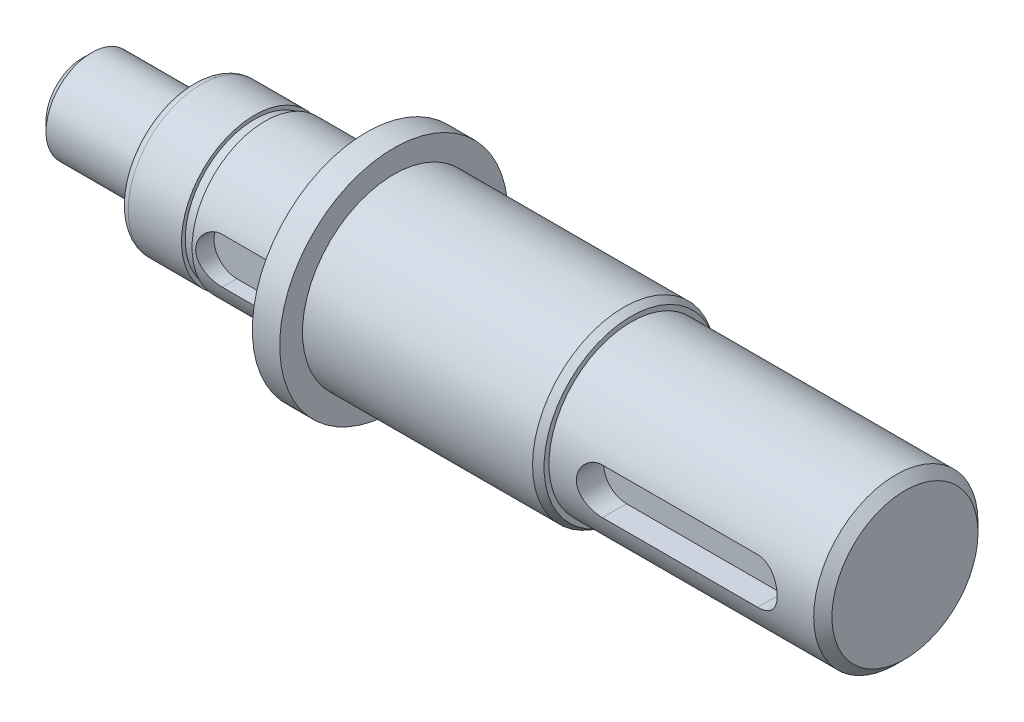
ISO-10303-21;
HEADER;
FILE_DESCRIPTION(('STEP AP214'),'2;1');
FILE_NAME('part.step','',(''),(''),'','','');
FILE_SCHEMA(('AUTOMOTIVE_DESIGN { 1 0 10303 214 1 1 1 1 }'));
ENDSEC;
DATA;
#1=APPLICATION_CONTEXT('core data for automotive mechanical design processes');
#2=APPLICATION_PROTOCOL_DEFINITION('international standard','automotive_design',2000,#1);
#3=PRODUCT_CONTEXT('',#1,'mechanical');
#4=PRODUCT('Part','Part','',(#3));
#5=PRODUCT_RELATED_PRODUCT_CATEGORY('part','',(#4));
#6=PRODUCT_DEFINITION_FORMATION('','',#4);
#7=PRODUCT_DEFINITION_CONTEXT('part definition',#1,'design');
#8=PRODUCT_DEFINITION('design','',#6,#7);
#9=PRODUCT_DEFINITION_SHAPE('','',#8);
#10=(LENGTH_UNIT() NAMED_UNIT(*) SI_UNIT(.MILLI.,.METRE.));
#11=(NAMED_UNIT(*) PLANE_ANGLE_UNIT() SI_UNIT($,.RADIAN.));
#12=(NAMED_UNIT(*) SI_UNIT($,.STERADIAN.) SOLID_ANGLE_UNIT());
#13=UNCERTAINTY_MEASURE_WITH_UNIT(LENGTH_MEASURE(1.E-05),#10,'distance_accuracy_value','');
#14=(GEOMETRIC_REPRESENTATION_CONTEXT(3) GLOBAL_UNCERTAINTY_ASSIGNED_CONTEXT((#13)) GLOBAL_UNIT_ASSIGNED_CONTEXT((#10,
#11,#12)) REPRESENTATION_CONTEXT('',''));
#15=CARTESIAN_POINT('',(0.,0.,0.));
#16=DIRECTION('',(0.,0.,1.));
#17=DIRECTION('',(1.,0.,0.));
#18=AXIS2_PLACEMENT_3D('',#15,#16,#17);
#19=CARTESIAN_POINT('',(-46.1,20.052,4.166614592372));
#20=DIRECTION('',(1.,0.,0.));
#21=DIRECTION('',(0.,-1.,0.));
#22=AXIS2_PLACEMENT_3D('',#19,#20,#21);
#23=PLANE('',#22);
#24=CARTESIAN_POINT('',(-46.1,15.892,0.));
#25=DIRECTION('',(1.,0.,0.));
#26=DIRECTION('',(0.,0.,-1.));
#27=AXIS2_PLACEMENT_3D('',#24,#25,#26);
#28=CIRCLE('',#27,3.99993093969182);
#29=CARTESIAN_POINT('',(-46.1,15.892,-3.99993093969182));
#30=VERTEX_POINT('',#29);
#31=EDGE_CURVE('E284',#30,#30,#28,.F.);
#32=ORIENTED_EDGE('',*,*,#31,.T.);
#33=EDGE_LOOP('',(#32));
#34=FACE_BOUND('',#33,.T.);
#35=ADVANCED_FACE('F17',(#34),#23,.F.);
#36=CARTESIAN_POINT('',(-46.1060096485574,15.892,0.));
#37=DIRECTION('',(1.,0.,0.));
#38=DIRECTION('',(0.,0.,-1.));
#39=AXIS2_PLACEMENT_3D('',#36,#37,#38);
#40=CONICAL_SURFACE('',#39,3.99392139489148,0.785389530779604);
#41=CARTESIAN_POINT('',(-45.0999136731147,15.892,0.));
#42=DIRECTION('',(1.,0.,0.));
#43=DIRECTION('',(0.,0.,-1.));
#44=AXIS2_PLACEMENT_3D('',#41,#42,#43);
#45=CIRCLE('',#44,5.);
#46=CARTESIAN_POINT('',(-45.0999136731147,15.892,-5.));
#47=VERTEX_POINT('',#46);
#48=EDGE_CURVE('E281',#47,#47,#45,.F.);
#49=ORIENTED_EDGE('',*,*,#48,.T.);
#50=EDGE_LOOP('',(#49));
#51=FACE_BOUND('',#50,.T.);
#52=ORIENTED_EDGE('',*,*,#31,.F.);
#53=EDGE_LOOP('',(#52));
#54=FACE_BOUND('',#53,.T.);
#55=ADVANCED_FACE('F610',(#51,#54),#40,.T.);
#56=CARTESIAN_POINT('',(-45.1660314850651,15.892,0.));
#57=DIRECTION('',(1.,0.,0.));
#58=DIRECTION('',(0.,0.,-1.));
#59=AXIS2_PLACEMENT_3D('',#56,#57,#58);
#60=CYLINDRICAL_SURFACE('',#59,5.);
#61=CARTESIAN_POINT('',(-34.1000000000029,15.892,0.));
#62=DIRECTION('',(1.,0.,0.));
#63=DIRECTION('',(0.,0.,-1.));
#64=AXIS2_PLACEMENT_3D('',#61,#62,#63);
#65=CIRCLE('',#64,5.);
#66=CARTESIAN_POINT('',(-34.1000000000029,15.892,-5.));
#67=VERTEX_POINT('',#66);
#68=EDGE_CURVE('E277',#67,#67,#65,.F.);
#69=ORIENTED_EDGE('',*,*,#68,.T.);
#70=EDGE_LOOP('',(#69));
#71=FACE_BOUND('',#70,.T.);
#72=ORIENTED_EDGE('',*,*,#48,.F.);
#73=EDGE_LOOP('',(#72));
#74=FACE_BOUND('',#73,.T.);
#75=ADVANCED_FACE('F312',(#71,#74),#60,.T.);
#76=CARTESIAN_POINT('',(-34.1,23.172,7.289055234136));
#77=DIRECTION('',(1.,0.,0.));
#78=DIRECTION('',(0.,-1.,0.));
#79=AXIS2_PLACEMENT_3D('',#76,#77,#78);
#80=PLANE('',#79);
#81=ORIENTED_EDGE('',*,*,#68,.F.);
#82=EDGE_LOOP('',(#81));
#83=FACE_BOUND('',#82,.T.);
#84=CARTESIAN_POINT('',(-34.1,15.892,0.));
#85=DIRECTION('',(1.,0.,0.));
#86=DIRECTION('',(0.,-1.,-3.17218194916288E-13));
#87=AXIS2_PLACEMENT_3D('',#84,#85,#86);
#88=CIRCLE('',#87,6.99999999999759);
#89=CARTESIAN_POINT('',(-34.1,22.891999999999,9.57036668880821E-10));
#90=VERTEX_POINT('',#89);
#91=CARTESIAN_POINT('',(-34.1,8.89200000000105,-3.19891899427937E-10));
#92=VERTEX_POINT('',#91);
#93=EDGE_CURVE('E100',#90,#92,#88,.F.);
#94=ORIENTED_EDGE('',*,*,#93,.T.);
#95=CARTESIAN_POINT('',(-34.1,15.892,0.));
#96=DIRECTION('',(1.,0.,0.));
#97=DIRECTION('',(0.,1.,2.27869295233494E-10));
#98=AXIS2_PLACEMENT_3D('',#95,#96,#97);
#99=CIRCLE('',#98,6.99999999999958);
#100=EDGE_CURVE('E280',#92,#90,#99,.F.);
#101=ORIENTED_EDGE('',*,*,#100,.T.);
#102=EDGE_LOOP('',(#94,#101));
#103=FACE_BOUND('',#102,.T.);
#104=ADVANCED_FACE('F311',(#83,#103),#80,.F.);
#105=CARTESIAN_POINT('',(-33.1,15.892,0.));
#106=DIRECTION('',(1.,0.,0.));
#107=DIRECTION('',(0.,0.999626843304634,0.0273161883287667));
#108=AXIS2_PLACEMENT_3D('',#105,#106,#107);
#109=TOROIDAL_SURFACE('',#108,6.99999999999756,1.);
#110=CARTESIAN_POINT('',(-33.1,15.892,0.));
#111=DIRECTION('',(1.,0.,0.));
#112=DIRECTION('',(0.,-1.,0.));
#113=AXIS2_PLACEMENT_3D('',#110,#111,#112);
#114=CIRCLE('',#113,8.);
#115=CARTESIAN_POINT('',(-33.1,7.892,0.));
#116=VERTEX_POINT('',#115);
#117=EDGE_CURVE('E276',#116,#116,#114,.F.);
#118=ORIENTED_EDGE('',*,*,#117,.T.);
#119=EDGE_LOOP('',(#118));
#120=FACE_BOUND('',#119,.T.);
#121=ORIENTED_EDGE('',*,*,#100,.F.);
#122=ORIENTED_EDGE('',*,*,#93,.F.);
#123=EDGE_LOOP('',(#121,#122));
#124=FACE_BOUND('',#123,.T.);
#125=ADVANCED_FACE('F295',(#120,#124),#109,.T.);
#126=CARTESIAN_POINT('',(-33.1,15.892,0.));
#127=DIRECTION('',(1.,0.,0.));
#128=DIRECTION('',(0.,0.,-1.));
#129=AXIS2_PLACEMENT_3D('',#126,#127,#128);
#130=CYLINDRICAL_SURFACE('',#129,8.);
#131=CARTESIAN_POINT('',(-27.25,15.892,0.));
#132=DIRECTION('',(1.,0.,0.));
#133=DIRECTION('',(0.,0.,-1.));
#134=AXIS2_PLACEMENT_3D('',#131,#132,#133);
#135=CIRCLE('',#134,8.);
#136=CARTESIAN_POINT('',(-27.25,15.892,-8.));
#137=VERTEX_POINT('',#136);
#138=EDGE_CURVE('E273',#137,#137,#135,.T.);
#139=ORIENTED_EDGE('',*,*,#138,.F.);
#140=EDGE_LOOP('',(#139));
#141=FACE_BOUND('',#140,.T.);
#142=ORIENTED_EDGE('',*,*,#117,.F.);
#143=EDGE_LOOP('',(#142));
#144=FACE_BOUND('',#143,.T.);
#145=ADVANCED_FACE('F310',(#141,#144),#130,.T.);
#146=CARTESIAN_POINT('',(-27.25,24.212,8.32));
#147=DIRECTION('',(1.,0.,0.));
#148=DIRECTION('',(0.,-1.,0.));
#149=AXIS2_PLACEMENT_3D('',#146,#147,#148);
#150=PLANE('',#149);
#151=CARTESIAN_POINT('',(-27.2499999999977,15.892,0.));
#152=DIRECTION('',(1.,0.,0.));
#153=DIRECTION('',(0.,0.,-1.));
#154=AXIS2_PLACEMENT_3D('',#151,#152,#153);
#155=CIRCLE('',#154,7.6);
#156=CARTESIAN_POINT('',(-27.2499999999977,15.892,-7.6));
#157=VERTEX_POINT('',#156);
#158=EDGE_CURVE('E270',#157,#157,#155,.F.);
#159=ORIENTED_EDGE('',*,*,#158,.T.);
#160=EDGE_LOOP('',(#159));
#161=FACE_BOUND('',#160,.T.);
#162=ORIENTED_EDGE('',*,*,#138,.T.);
#163=EDGE_LOOP('',(#162));
#164=FACE_BOUND('',#163,.T.);
#165=ADVANCED_FACE('F335',(#161,#164),#150,.T.);
#166=CARTESIAN_POINT('',(-27.2499999999977,15.892,0.));
#167=DIRECTION('',(1.,0.,0.));
#168=DIRECTION('',(0.,0.,-1.));
#169=AXIS2_PLACEMENT_3D('',#166,#167,#168);
#170=CYLINDRICAL_SURFACE('',#169,7.6);
#171=CARTESIAN_POINT('',(-26.1000000000023,15.892,0.));
#172=DIRECTION('',(1.,0.,0.));
#173=DIRECTION('',(0.,0.,-1.));
#174=AXIS2_PLACEMENT_3D('',#171,#172,#173);
#175=CIRCLE('',#174,7.6);
#176=CARTESIAN_POINT('',(-26.1000000000023,15.892,-7.6));
#177=VERTEX_POINT('',#176);
#178=EDGE_CURVE('E263',#177,#177,#175,.F.);
#179=ORIENTED_EDGE('',*,*,#178,.T.);
#180=EDGE_LOOP('',(#179));
#181=FACE_BOUND('',#180,.T.);
#182=ORIENTED_EDGE('',*,*,#158,.F.);
#183=EDGE_LOOP('',(#182));
#184=FACE_BOUND('',#183,.T.);
#185=ADVANCED_FACE('F339',(#181,#184),#170,.T.);
#186=CARTESIAN_POINT('',(-27.00141579005,13.27192889347,6.));
#187=DIRECTION('',(0.,0.,1.));
#188=DIRECTION('',(1.,0.,0.));
#189=AXIS2_PLACEMENT_3D('',#186,#187,#188);
#190=PLANE('',#189);
#191=CARTESIAN_POINT('',(-17.9,15.892,5.99999999999976));
#192=DIRECTION('',(0.,0.,1.));
#193=DIRECTION('',(0.,-1.,0.));
#194=AXIS2_PLACEMENT_3D('',#191,#192,#193);
#195=CIRCLE('',#194,2.5);
#196=CARTESIAN_POINT('',(-17.8999999999994,18.392,5.99999999999979));
#197=VERTEX_POINT('',#196);
#198=CARTESIAN_POINT('',(-17.8999999999996,13.392,5.99999999999979));
#199=VERTEX_POINT('',#198);
#200=EDGE_CURVE('E259',#197,#199,#195,.F.);
#201=ORIENTED_EDGE('',*,*,#200,.F.);
#202=DIRECTION('',(-1.,0.,0.));
#203=VECTOR('',#202,1.);
#204=CARTESIAN_POINT('',(-20.55,18.392,5.99999999999981));
#205=LINE('',#204,#203);
#206=CARTESIAN_POINT('',(-23.1999999999986,18.392,5.9999999999998));
#207=VERTEX_POINT('',#206);
#208=EDGE_CURVE('E266',#197,#207,#205,.T.);
#209=ORIENTED_EDGE('',*,*,#208,.T.);
#210=CARTESIAN_POINT('',(-23.2,15.892,5.99999999999979));
#211=DIRECTION('',(0.,0.,1.));
#212=DIRECTION('',(1.,0.,0.));
#213=AXIS2_PLACEMENT_3D('',#210,#211,#212);
#214=CIRCLE('',#213,2.5);
#215=CARTESIAN_POINT('',(-23.1999999999987,13.392,5.9999999999998));
#216=VERTEX_POINT('',#215);
#217=EDGE_CURVE('E93',#216,#207,#214,.F.);
#218=ORIENTED_EDGE('',*,*,#217,.F.);
#219=DIRECTION('',(1.,0.,0.));
#220=VECTOR('',#219,1.);
#221=CARTESIAN_POINT('',(-20.55,13.392,5.99999999999981));
#222=LINE('',#221,#220);
#223=EDGE_CURVE('E267',#216,#199,#222,.T.);
#224=ORIENTED_EDGE('',*,*,#223,.T.);
#225=EDGE_LOOP('',(#201,#209,#218,#224));
#226=FACE_BOUND('',#225,.T.);
#227=ADVANCED_FACE('F341',(#226),#190,.T.);
#228=CARTESIAN_POINT('',(-23.2,15.892,5.99999999999979));
#229=DIRECTION('',(0.,0.,1.));
#230=DIRECTION('',(1.,0.,0.));
#231=AXIS2_PLACEMENT_3D('',#228,#229,#230);
#232=CYLINDRICAL_SURFACE('',#231,2.5);
#233=ORIENTED_EDGE('',*,*,#217,.T.);
#234=DIRECTION('',(0.,0.,1.));
#235=VECTOR('',#234,1.);
#236=CARTESIAN_POINT('',(-23.1999999999971,18.392,6.7996710383925));
#237=LINE('',#236,#235);
#238=CARTESIAN_POINT('',(-23.1999999999986,18.3920000000008,7.59934207678505));
#239=VERTEX_POINT('',#238);
#240=EDGE_CURVE('E641',#207,#239,#237,.T.);
#241=ORIENTED_EDGE('',*,*,#240,.T.);
#242=CARTESIAN_POINT('',(-23.1999999999991,18.392,7.59934207678533));
#243=CARTESIAN_POINT('',(-23.268466040457,18.3920087198661,7.59933203220922));
#244=CARTESIAN_POINT('',(-23.3369263800278,18.3891876157067,7.60026710840751));
#245=CARTESIAN_POINT('',(-23.4733214902587,18.3779536316015,7.60395280971294));
#246=CARTESIAN_POINT('',(-23.541256383595,18.369542099326,7.60670299725463));
#247=CARTESIAN_POINT('',(-23.675938990515,18.3472250498683,7.61393458112739));
#248=CARTESIAN_POINT('',(-23.7426894002958,18.3333343337494,7.6184113127803));
#249=CARTESIAN_POINT('',(-23.8747019778926,18.3001974202135,7.62895048428862));
#250=CARTESIAN_POINT('',(-23.9399641014081,18.2809510636041,7.63501297127909));
#251=CARTESIAN_POINT('',(-24.132787776406,18.2154218181209,7.65531370854744));
#252=CARTESIAN_POINT('',(-24.2575680580731,18.1613183478365,7.67167572075663));
#253=CARTESIAN_POINT('',(-24.4962875697815,18.0339585337533,7.70820192005291));
#254=CARTESIAN_POINT('',(-24.6102211254839,17.96069223943,7.72836808096848));
#255=CARTESIAN_POINT('',(-24.8279499761722,17.794394884502,7.77100200100192));
#256=CARTESIAN_POINT('',(-24.9313222643879,17.700822206298,7.79352168290418));
#257=CARTESIAN_POINT('',(-25.121190817295,17.4977272795654,7.83788426191883));
#258=CARTESIAN_POINT('',(-25.2076841783887,17.3882022924899,7.85972704204449));
#259=CARTESIAN_POINT('',(-25.3632232640836,17.1532495377186,7.90087147079035));
#260=CARTESIAN_POINT('',(-25.4318300473664,17.0275180788054,7.92010445950419));
#261=CARTESIAN_POINT('',(-25.5467540849779,16.7656029603361,7.95325160259874));
#262=CARTESIAN_POINT('',(-25.5930774702847,16.6294221877389,7.96716721976599));
#263=CARTESIAN_POINT('',(-25.6607018859891,16.354930099013,7.98774341182987));
#264=CARTESIAN_POINT('',(-25.6827310447468,16.2168142475096,7.99461464054533));
#265=CARTESIAN_POINT('',(-25.7034487255046,15.9386844774618,8.00107192504111));
#266=CARTESIAN_POINT('',(-25.7021420799053,15.7986709578888,8.00065948912981));
#267=CARTESIAN_POINT('',(-25.6767033454027,15.5258502685509,7.99274230032519));
#268=CARTESIAN_POINT('',(-25.6533609718519,15.3929612040198,7.98548293529428));
#269=CARTESIAN_POINT('',(-25.5858095044392,15.1330924132136,7.96498949974393));
#270=CARTESIAN_POINT('',(-25.5415992887317,15.0061130050421,7.95175510801149));
#271=CARTESIAN_POINT('',(-25.4330593669408,14.7598431445353,7.92046911120723));
#272=CARTESIAN_POINT('',(-25.3684898247105,14.6406659405492,7.90236047968));
#273=CARTESIAN_POINT('',(-25.2212568035245,14.4145938380772,7.86323423851875));
#274=CARTESIAN_POINT('',(-25.1385889392499,14.3077019259718,7.84221592430786));
#275=CARTESIAN_POINT('',(-24.9534618636045,14.104534133926,7.79847545376818));
#276=CARTESIAN_POINT('',(-24.8503225922691,14.0088845641417,7.77571879037668));
#277=CARTESIAN_POINT('',(-24.6292296898957,13.8360346115086,7.7318162261217));
#278=CARTESIAN_POINT('',(-24.5112716111507,13.7588397879334,7.71067081193149));
#279=CARTESIAN_POINT('',(-24.2620970568147,13.6243507400244,7.67220528704834));
#280=CARTESIAN_POINT('',(-24.130741698535,13.5672997270673,7.65493278862487));
#281=CARTESIAN_POINT('',(-23.8596881269535,13.4763908777028,7.62673815128791));
#282=CARTESIAN_POINT('',(-23.7200031693129,13.4424972061721,7.61580620458638));
#283=CARTESIAN_POINT('',(-23.5158248989925,13.4112165686691,7.60564225124822));
#284=CARTESIAN_POINT('',(-23.4528550630587,13.4040119274096,7.60328541577439));
#285=CARTESIAN_POINT('',(-23.3266010066542,13.3944075529522,7.60013482131107));
#286=CARTESIAN_POINT('',(-23.2633173572024,13.3920010344104,7.59933885501905));
#287=CARTESIAN_POINT('',(-23.1999999999996,13.392,7.59934207678533));
#288=B_SPLINE_CURVE_WITH_KNOTS('',3,(#242,#243,#244,#245,#246,#247,#248,#249,#250,#251,#252,
#253,#254,#255,#256,#257,#258,#259,#260,#261,#262,#263,#264,#265,#266,#267,#268,#269,#270,#271,
#272,#273,#274,#275,#276,#277,#278,#279,#280,#281,#282,#283,#284,#285,#286,#287),.UNSPECIFIED.,
.F.,.F.,(4,2,2,2,2,2,2,2,2,2,2,2,2,2,2,2,2,2,2,2,2,2,4),(0.,0.205323959879018,0.410598440771324,
0.615322164613738,0.820051974362681,1.22896577749252,1.63809233699269,2.05988351400973,
2.48174718582279,2.91315381297349,3.34444167638904,3.76241894392413,4.18030965733322,
4.58377069824367,4.98725343150322,5.39567896994651,5.80420358180202,6.22971654236821,
6.6553575226075,7.0859747210148,7.51592403685468,7.70602799872379,7.89586293072618),.UNSPECIFIED.);
#289=CARTESIAN_POINT('',(-23.1999999999985,13.392,7.59934207678531));
#290=VERTEX_POINT('',#289);
#291=EDGE_CURVE('E253',#239,#290,#288,.T.);
#292=ORIENTED_EDGE('',*,*,#291,.T.);
#293=DIRECTION('',(0.,0.,-1.));
#294=VECTOR('',#293,1.);
#295=CARTESIAN_POINT('',(-23.1999999999973,13.392,6.7996710383925));
#296=LINE('',#295,#294);
#297=EDGE_CURVE('E269',#290,#216,#296,.T.);
#298=ORIENTED_EDGE('',*,*,#297,.T.);
#299=EDGE_LOOP('',(#233,#241,#292,#298));
#300=FACE_BOUND('',#299,.T.);
#301=ADVANCED_FACE('F239',(#300),#232,.F.);
#302=CARTESIAN_POINT('',(-23.32007110653,13.392,5.879928893467));
#303=DIRECTION('',(0.,-1.,0.));
#304=DIRECTION('',(1.,0.,0.));
#305=AXIS2_PLACEMENT_3D('',#302,#303,#304);
#306=PLANE('',#305);
#307=ORIENTED_EDGE('',*,*,#223,.F.);
#308=ORIENTED_EDGE('',*,*,#297,.F.);
#309=DIRECTION('',(1.,0.,0.));
#310=VECTOR('',#309,1.);
#311=CARTESIAN_POINT('',(-24.8,13.392,7.59934207678529));
#312=LINE('',#311,#310);
#313=CARTESIAN_POINT('',(-17.8999999999996,13.392,7.59934207678531));
#314=VERTEX_POINT('',#313);
#315=EDGE_CURVE('E252',#290,#314,#312,.T.);
#316=ORIENTED_EDGE('',*,*,#315,.T.);
#317=DIRECTION('',(0.,0.,1.));
#318=VECTOR('',#317,1.);
#319=CARTESIAN_POINT('',(-17.8999999999992,13.392,7.240537065298));
#320=LINE('',#319,#318);
#321=EDGE_CURVE('E258',#199,#314,#320,.T.);
#322=ORIENTED_EDGE('',*,*,#321,.F.);
#323=EDGE_LOOP('',(#307,#308,#316,#322));
#324=FACE_BOUND('',#323,.T.);
#325=ADVANCED_FACE('F344',(#324),#306,.F.);
#326=CARTESIAN_POINT('',(-26.1,24.212,8.32));
#327=DIRECTION('',(1.,0.,0.));
#328=DIRECTION('',(0.,-1.,0.));
#329=AXIS2_PLACEMENT_3D('',#326,#327,#328);
#330=PLANE('',#329);
#331=ORIENTED_EDGE('',*,*,#178,.F.);
#332=EDGE_LOOP('',(#331));
#333=FACE_BOUND('',#332,.T.);
#334=CARTESIAN_POINT('',(-26.1000000000004,15.892,0.));
#335=DIRECTION('',(1.,0.,0.));
#336=DIRECTION('',(0.,0.,-1.));
#337=AXIS2_PLACEMENT_3D('',#334,#335,#336);
#338=CIRCLE('',#337,8.);
#339=CARTESIAN_POINT('',(-26.1000000000004,15.892,-8.));
#340=VERTEX_POINT('',#339);
#341=EDGE_CURVE('E251',#340,#340,#338,.F.);
#342=ORIENTED_EDGE('',*,*,#341,.T.);
#343=EDGE_LOOP('',(#342));
#344=FACE_BOUND('',#343,.T.);
#345=ADVANCED_FACE('F346',(#333,#344),#330,.F.);
#346=CARTESIAN_POINT('',(-17.77992889347,18.392,5.879928893467));
#347=DIRECTION('',(0.,1.,0.));
#348=DIRECTION('',(-1.,0.,0.));
#349=AXIS2_PLACEMENT_3D('',#346,#347,#348);
#350=PLANE('',#349);
#351=ORIENTED_EDGE('',*,*,#208,.F.);
#352=DIRECTION('',(0.,0.,-1.));
#353=VECTOR('',#352,1.);
#354=CARTESIAN_POINT('',(-17.8999999999988,18.392,7.240537065298));
#355=LINE('',#354,#353);
#356=CARTESIAN_POINT('',(-17.8999999999994,18.3920000000005,7.59934207678505));
#357=VERTEX_POINT('',#356);
#358=EDGE_CURVE('E262',#357,#197,#355,.T.);
#359=ORIENTED_EDGE('',*,*,#358,.F.);
#360=DIRECTION('',(-1.,0.,0.));
#361=VECTOR('',#360,1.);
#362=CARTESIAN_POINT('',(-24.8,18.3920000000017,7.59934207678477));
#363=LINE('',#362,#361);
#364=EDGE_CURVE('E219',#357,#239,#363,.T.);
#365=ORIENTED_EDGE('',*,*,#364,.T.);
#366=ORIENTED_EDGE('',*,*,#240,.F.);
#367=EDGE_LOOP('',(#351,#359,#365,#366));
#368=FACE_BOUND('',#367,.T.);
#369=ADVANCED_FACE('F146',(#368),#350,.F.);
#370=CARTESIAN_POINT('',(-17.9,15.892,5.99999999999976));
#371=DIRECTION('',(0.,0.,1.));
#372=DIRECTION('',(0.,-1.,0.));
#373=AXIS2_PLACEMENT_3D('',#370,#371,#372);
#374=CYLINDRICAL_SURFACE('',#373,2.5);
#375=CARTESIAN_POINT('',(-17.9,13.392,7.59934207678533));
#376=CARTESIAN_POINT('',(-17.8307676309302,13.3919906346233,7.59933144652561));
#377=CARTESIAN_POINT('',(-17.7615403165906,13.3948756110885,7.60028787623918));
#378=CARTESIAN_POINT('',(-17.6236209875084,13.4063632206783,7.60405660679211));
#379=CARTESIAN_POINT('',(-17.5549289045328,13.414965112514,7.60686866701922));
#380=CARTESIAN_POINT('',(-17.420282699433,13.4375313680281,7.61417839126841));
#381=CARTESIAN_POINT('',(-17.3543029742056,13.451357023005,7.6186323875736));
#382=CARTESIAN_POINT('',(-17.2238131843165,13.4842411911719,7.62908875779236));
#383=CARTESIAN_POINT('',(-17.1593029136853,13.5032989660408,7.63509091323304));
#384=CARTESIAN_POINT('',(-16.9912061568558,13.5604225465108,7.65278632583324));
#385=CARTESIAN_POINT('',(-16.8891690129333,13.6028306413595,7.66565720793278));
#386=CARTESIAN_POINT('',(-16.7402446128303,13.6765686484905,7.68716672499754));
#387=CARTESIAN_POINT('',(-16.6907939064981,13.7031712990599,7.6947961786488));
#388=CARTESIAN_POINT('',(-16.5938753541194,13.7595891478415,7.71062133362359));
#389=CARTESIAN_POINT('',(-16.5464068884295,13.7894033315457,7.71881685583697));
#390=CARTESIAN_POINT('',(-16.5000000000017,13.8207684822781,7.7272245987803));
#391=B_SPLINE_CURVE_WITH_KNOTS('',3,(#375,#376,#377,#378,#379,#380,#381,#382,#383,#384,#385,
#386,#387,#388,#389,#390),.UNSPECIFIED.,.F.,.F.,(4,2,2,2,2,2,2,4),(0.,0.207622136681109,
0.415217357110299,0.617648837901875,0.82005176761171,1.15261657682252,1.32251533214893,
1.49236057379962),.UNSPECIFIED.);
#392=CARTESIAN_POINT('',(-16.5000000000008,13.8207684822787,7.72722459877862));
#393=VERTEX_POINT('',#392);
#394=EDGE_CURVE('E245',#314,#393,#391,.T.);
#395=ORIENTED_EDGE('',*,*,#394,.T.);
#396=CARTESIAN_POINT('',(-16.4999999999987,17.9632315177199,7.72722459877718));
#397=CARTESIAN_POINT('',(-16.4471427126387,17.927508338568,7.73683009394156));
#398=CARTESIAN_POINT('',(-16.39613754107,17.8900816328268,7.74945716500654));
#399=CARTESIAN_POINT('',(-16.2980844717545,17.8123546853294,7.77942145014326));
#400=CARTESIAN_POINT('',(-16.2510247354012,17.7720637634431,7.79674386089434));
#401=CARTESIAN_POINT('',(-16.1610080491993,17.6891196952703,7.83474751936062));
#402=CARTESIAN_POINT('',(-16.118031957615,17.6464792186134,7.85541172995629));
#403=CARTESIAN_POINT('',(-16.0358066346301,17.5588519538789,7.89917695815186));
#404=CARTESIAN_POINT('',(-15.996560929259,17.513863006989,7.92228023852264));
#405=CARTESIAN_POINT('',(-15.911237298747,17.408774357714,7.97674573975147));
#406=CARTESIAN_POINT('',(-15.8663345671442,17.3479783452396,8.00860565369107));
#407=CARTESIAN_POINT('',(-15.7823870511854,17.222935323822,8.0732598184387));
#408=CARTESIAN_POINT('',(-15.7433435802625,17.1586875454887,8.10605427678302));
#409=CARTESIAN_POINT('',(-15.6709991652825,17.0265643067415,8.17107706387074));
#410=CARTESIAN_POINT('',(-15.6377089477016,16.9586823727563,8.2033042366342));
#411=CARTESIAN_POINT('',(-15.5771045147689,16.8193247518581,8.26538007025524));
#412=CARTESIAN_POINT('',(-15.5497860491919,16.7478516656966,8.29523041307113));
#413=CARTESIAN_POINT('',(-15.49733464839,16.5886634970294,8.3552084265505));
#414=CARTESIAN_POINT('',(-15.4733468947828,16.5002418068047,8.38453420328385));
#415=CARTESIAN_POINT('',(-15.4445704885365,16.3642353004137,8.42094474397633));
#416=CARTESIAN_POINT('',(-15.4361858577654,16.3184031074565,8.43180876694419));
#417=CARTESIAN_POINT('',(-15.4219356239277,16.2257526088139,8.45052527207993));
#418=CARTESIAN_POINT('',(-15.4160686314022,16.178934862052,8.45837941511325));
#419=CARTESIAN_POINT('',(-15.4069204709648,16.083983582356,8.47071992959463));
#420=CARTESIAN_POINT('',(-15.4036733949887,16.035840876608,8.47516186483016));
#421=CARTESIAN_POINT('',(-15.3999794131921,15.9392474247854,8.48022057581262));
#422=CARTESIAN_POINT('',(-15.3995322650363,15.890796705733,8.48083768260056));
#423=CARTESIAN_POINT('',(-15.401451421842,15.7940271765907,8.47820399474554));
#424=CARTESIAN_POINT('',(-15.4038195436657,15.7457084718771,8.47495070230127));
#425=CARTESIAN_POINT('',(-15.4113057046628,15.6496738359529,8.4647900975488));
#426=CARTESIAN_POINT('',(-15.4164242159587,15.6019580096702,8.4578821578995));
#427=CARTESIAN_POINT('',(-15.430220870351,15.5006295915979,8.43959046264796));
#428=CARTESIAN_POINT('',(-15.439307331954,15.4471643858342,8.42770320504371));
#429=CARTESIAN_POINT('',(-15.460709817151,15.3417637238871,8.40045715541123));
#430=CARTESIAN_POINT('',(-15.4730284561016,15.2898295445809,8.38509555346947));
#431=CARTESIAN_POINT('',(-15.5007443461197,15.187445124131,8.35164063289247));
#432=CARTESIAN_POINT('',(-15.5161544759742,15.1370021389172,8.3335359668943));
#433=CARTESIAN_POINT('',(-15.5498506646406,15.0378699383645,8.29539467249833));
#434=CARTESIAN_POINT('',(-15.5681359379182,14.9891802484505,8.27535857237551));
#435=CARTESIAN_POINT('',(-15.616787309896,14.8708477231922,8.22421567236482));
#436=CARTESIAN_POINT('',(-15.6487754541508,14.8021933060676,8.19235695989968));
#437=CARTESIAN_POINT('',(-15.7186038991308,14.6683948832343,8.12763861334563));
#438=CARTESIAN_POINT('',(-15.7564473940816,14.6032528199067,8.09477844084207));
#439=CARTESIAN_POINT('',(-15.8378094434959,14.476727097249,8.02980600135416));
#440=CARTESIAN_POINT('',(-15.8812999023814,14.4153269070777,7.99769090271235));
#441=CARTESIAN_POINT('',(-15.9742003265235,14.2960648272229,7.93564357325767));
#442=CARTESIAN_POINT('',(-16.0236067949193,14.2382008775771,7.90571006960731));
#443=CARTESIAN_POINT('',(-16.1379281597735,14.1162577452054,7.84477577982577));
#444=CARTESIAN_POINT('',(-16.2040397717132,14.0528943045051,7.81452588699238));
#445=CARTESIAN_POINT('',(-16.3098655331644,13.9623253459424,7.77587668167656));
#446=CARTESIAN_POINT('',(-16.346372295547,13.9327984720178,7.76408895003779));
#447=CARTESIAN_POINT('',(-16.4215716943065,13.8754454529992,7.74336330145432));
#448=CARTESIAN_POINT('',(-16.4602681267636,13.8476224471132,7.73443052392133));
#449=CARTESIAN_POINT('',(-16.5000000000012,13.8207684822784,7.72722459877672));
#450=B_SPLINE_CURVE_WITH_KNOTS('',3,(#396,#397,#398,#399,#400,#401,#402,#403,#404,#405,#406,
#407,#408,#409,#410,#411,#412,#413,#414,#415,#416,#417,#418,#419,#420,#421,#422,#423,#424,#425,
#426,#427,#428,#429,#430,#431,#432,#433,#434,#435,#436,#437,#438,#439,#440,#441,#442,#443,#444,
#445,#446,#447,#448,#449),.UNSPECIFIED.,.F.,.F.,(4,2,2,2,2,2,2,2,2,2,2,2,2,2,2,2,2,2,2,2,2,2,2,
2,2,2,4),(0.,0.193250382530402,0.385898438960346,0.577593627803931,0.769468245211612,
1.01521129125635,1.26100934192758,1.50726083192933,1.75333648463101,2.04090367885842,
2.18429162223625,2.32760032917257,2.47274507057201,2.61787724943848,2.76310314165579,
2.90835397082064,3.07465137742126,3.24108376285949,3.40822444803153,3.57531954683954,
3.82149027685007,4.06779577511818,4.31291968500812,4.55789941463913,4.84629233884293,
4.99137772778695,5.13672284337354),.UNSPECIFIED.);
#451=CARTESIAN_POINT('',(-16.4999999999989,17.9632315177201,7.72722459877897));
#452=VERTEX_POINT('',#451);
#453=EDGE_CURVE('E216',#452,#393,#450,.T.);
#454=ORIENTED_EDGE('',*,*,#453,.F.);
#455=CARTESIAN_POINT('',(-16.4999999999991,17.9632315177202,7.72722459878076));
#456=CARTESIAN_POINT('',(-16.5572576287368,18.0019302687206,7.71685040055971));
#457=CARTESIAN_POINT('',(-16.6161328841104,18.038267441562,7.70680045716944));
#458=CARTESIAN_POINT('',(-16.7368243715057,18.1060056936098,7.68761470540059));
#459=CARTESIAN_POINT('',(-16.798641560039,18.1374051529351,7.67847919737018));
#460=CARTESIAN_POINT('',(-16.9846845319694,18.2223252891697,7.65330255914644));
#461=CARTESIAN_POINT('',(-17.1125525484273,18.2686214418371,7.63891850773689));
#462=CARTESIAN_POINT('',(-17.3490516245295,18.3329903823897,7.61856070844167));
#463=CARTESIAN_POINT('',(-17.4565909282397,18.3547999005783,7.61149567234235));
#464=CARTESIAN_POINT('',(-17.6205869692455,18.3769669093952,7.60427482839083));
#465=CARTESIAN_POINT('',(-17.6762920502044,18.3825993622095,7.6024298071624));
#466=CARTESIAN_POINT('',(-17.7879934397338,18.3901174837234,7.59996159124603));
#467=CARTESIAN_POINT('',(-17.8439898091114,18.392002335825,7.59933866285112));
#468=CARTESIAN_POINT('',(-17.9,18.392,7.59934207678533));
#469=B_SPLINE_CURVE_WITH_KNOTS('',3,(#455,#456,#457,#458,#459,#460,#461,#462,#463,#464,#465,
#466,#467,#468),.UNSPECIFIED.,.F.,.F.,(4,2,2,2,2,2,4),(0.,0.209526251011705,0.419121097073448,
0.827280799579489,1.15610612128947,1.32403788991832,1.49200624667908),.UNSPECIFIED.);
#470=EDGE_CURVE('E222',#452,#357,#469,.T.);
#471=ORIENTED_EDGE('',*,*,#470,.T.);
#472=ORIENTED_EDGE('',*,*,#358,.T.);
#473=ORIENTED_EDGE('',*,*,#200,.T.);
#474=ORIENTED_EDGE('',*,*,#321,.T.);
#475=EDGE_LOOP('',(#395,#454,#471,#472,#473,#474));
#476=FACE_BOUND('',#475,.T.);
#477=ADVANCED_FACE('F234',(#476),#374,.F.);
#478=CARTESIAN_POINT('',(-26.1000000000004,15.892,0.));
#479=DIRECTION('',(1.,0.,0.));
#480=DIRECTION('',(0.,0.,-1.));
#481=AXIS2_PLACEMENT_3D('',#478,#479,#480);
#482=CYLINDRICAL_SURFACE('',#481,8.);
#483=ORIENTED_EDGE('',*,*,#341,.F.);
#484=EDGE_LOOP('',(#483));
#485=FACE_BOUND('',#484,.T.);
#486=ORIENTED_EDGE('',*,*,#470,.F.);
#487=CARTESIAN_POINT('',(-16.5,15.892,0.));
#488=DIRECTION('',(1.,0.,0.));
#489=DIRECTION('',(0.,0.999796811571951,-0.0201577670033347));
#490=AXIS2_PLACEMENT_3D('',#487,#488,#489);
#491=CIRCLE('',#490,7.99999999999646);
#492=EDGE_CURVE('E125',#393,#452,#491,.T.);
#493=ORIENTED_EDGE('',*,*,#492,.F.);
#494=ORIENTED_EDGE('',*,*,#394,.F.);
#495=ORIENTED_EDGE('',*,*,#315,.F.);
#496=ORIENTED_EDGE('',*,*,#291,.F.);
#497=ORIENTED_EDGE('',*,*,#364,.F.);
#498=EDGE_LOOP('',(#486,#493,#494,#495,#496,#497));
#499=FACE_BOUND('',#498,.T.);
#500=ADVANCED_FACE('F205',(#485,#499),#482,.T.);
#501=CARTESIAN_POINT('',(-16.5,15.892,0.));
#502=DIRECTION('',(1.,0.,0.));
#503=DIRECTION('',(0.,0.999796811571951,-0.0201577670033338));
#504=AXIS2_PLACEMENT_3D('',#501,#502,#503);
#505=TOROIDAL_SURFACE('',#504,9.49999999999647,1.5);
#506=CARTESIAN_POINT('',(-15.,15.892,0.));
#507=DIRECTION('',(-1.,0.,0.));
#508=DIRECTION('',(0.,1.,1.32912350031486E-10));
#509=AXIS2_PLACEMENT_3D('',#506,#507,#508);
#510=CIRCLE('',#509,9.49999999998851);
#511=CARTESIAN_POINT('',(-15.,25.3919999999915,2.19839879807303E-10));
#512=VERTEX_POINT('',#511);
#513=CARTESIAN_POINT('',(-15.,6.39200000000849,-4.88702996256253E-10));
#514=VERTEX_POINT('',#513);
#515=EDGE_CURVE('E115',#512,#514,#510,.T.);
#516=ORIENTED_EDGE('',*,*,#515,.T.);
#517=CARTESIAN_POINT('',(-15.,15.892,0.));
#518=DIRECTION('',(-1.,0.,0.));
#519=DIRECTION('',(0.,-1.,-1.3290290035366E-10));
#520=AXIS2_PLACEMENT_3D('',#517,#518,#519);
#521=CIRCLE('',#520,9.49999999998452);
#522=EDGE_CURVE('E110',#514,#512,#521,.T.);
#523=ORIENTED_EDGE('',*,*,#522,.T.);
#524=EDGE_LOOP('',(#516,#523));
#525=FACE_BOUND('',#524,.T.);
#526=ORIENTED_EDGE('',*,*,#453,.T.);
#527=ORIENTED_EDGE('',*,*,#492,.T.);
#528=EDGE_LOOP('',(#526,#527));
#529=FACE_BOUND('',#528,.T.);
#530=ADVANCED_FACE('F113',(#525,#529),#505,.F.);
#531=CARTESIAN_POINT('',(-15.,28.892,13.01617606806));
#532=DIRECTION('',(1.,0.,0.));
#533=DIRECTION('',(0.,-1.,0.));
#534=AXIS2_PLACEMENT_3D('',#531,#532,#533);
#535=PLANE('',#534);
#536=ORIENTED_EDGE('',*,*,#515,.F.);
#537=ORIENTED_EDGE('',*,*,#522,.F.);
#538=EDGE_LOOP('',(#536,#537));
#539=FACE_BOUND('',#538,.T.);
#540=CARTESIAN_POINT('',(-14.9999999999974,15.892,0.));
#541=DIRECTION('',(1.,0.,0.));
#542=DIRECTION('',(0.,0.,-1.));
#543=AXIS2_PLACEMENT_3D('',#540,#541,#542);
#544=CIRCLE('',#543,12.5);
#545=CARTESIAN_POINT('',(-14.9999999999974,15.892,-12.5));
#546=VERTEX_POINT('',#545);
#547=EDGE_CURVE('E119',#546,#546,#544,.F.);
#548=ORIENTED_EDGE('',*,*,#547,.T.);
#549=EDGE_LOOP('',(#548));
#550=FACE_BOUND('',#549,.T.);
#551=ADVANCED_FACE('F123',(#539,#550),#535,.F.);
#552=CARTESIAN_POINT('',(-14.9999999999974,15.892,0.));
#553=DIRECTION('',(1.,0.,0.));
#554=DIRECTION('',(0.,0.,-1.));
#555=AXIS2_PLACEMENT_3D('',#552,#553,#554);
#556=CYLINDRICAL_SURFACE('',#555,12.5);
#557=CARTESIAN_POINT('',(-12.0000000000025,15.892,0.));
#558=DIRECTION('',(1.,0.,0.));
#559=DIRECTION('',(0.,0.,-1.));
#560=AXIS2_PLACEMENT_3D('',#557,#558,#559);
#561=CIRCLE('',#560,12.5);
#562=CARTESIAN_POINT('',(-12.0000000000025,15.892,-12.5));
#563=VERTEX_POINT('',#562);
#564=EDGE_CURVE('E419',#563,#563,#561,.T.);
#565=ORIENTED_EDGE('',*,*,#564,.F.);
#566=EDGE_LOOP('',(#565));
#567=FACE_BOUND('',#566,.T.);
#568=ORIENTED_EDGE('',*,*,#547,.F.);
#569=EDGE_LOOP('',(#568));
#570=FACE_BOUND('',#569,.T.);
#571=ADVANCED_FACE('F145',(#567,#570),#556,.T.);
#572=CARTESIAN_POINT('',(-12.,28.892,13.01617606806));
#573=DIRECTION('',(1.,0.,0.));
#574=DIRECTION('',(0.,-1.,0.));
#575=AXIS2_PLACEMENT_3D('',#572,#573,#574);
#576=PLANE('',#575);
#577=CARTESIAN_POINT('',(-11.9999999999981,15.892,0.));
#578=DIRECTION('',(1.,0.,0.));
#579=DIRECTION('',(0.,0.,-1.));
#580=AXIS2_PLACEMENT_3D('',#577,#578,#579);
#581=CIRCLE('',#580,10.);
#582=CARTESIAN_POINT('',(-11.9999999999981,15.892,-10.));
#583=VERTEX_POINT('',#582);
#584=EDGE_CURVE('E417',#583,#583,#581,.F.);
#585=ORIENTED_EDGE('',*,*,#584,.T.);
#586=EDGE_LOOP('',(#585));
#587=FACE_BOUND('',#586,.T.);
#588=ORIENTED_EDGE('',*,*,#564,.T.);
#589=EDGE_LOOP('',(#588));
#590=FACE_BOUND('',#589,.T.);
#591=ADVANCED_FACE('F148',(#587,#590),#576,.T.);
#592=CARTESIAN_POINT('',(-11.9999999999981,15.892,0.));
#593=DIRECTION('',(1.,0.,0.));
#594=DIRECTION('',(0.,0.,-1.));
#595=AXIS2_PLACEMENT_3D('',#592,#593,#594);
#596=CYLINDRICAL_SURFACE('',#595,10.);
#597=ORIENTED_EDGE('',*,*,#584,.F.);
#598=EDGE_LOOP('',(#597));
#599=FACE_BOUND('',#598,.T.);
#600=CARTESIAN_POINT('',(13.1998396045769,15.892,0.));
#601=DIRECTION('',(-1.,0.,0.));
#602=DIRECTION('',(0.,0.,1.));
#603=AXIS2_PLACEMENT_3D('',#600,#601,#602);
#604=CIRCLE('',#603,10.);
#605=CARTESIAN_POINT('',(13.1998396045769,15.892,10.));
#606=VERTEX_POINT('',#605);
#607=EDGE_CURVE('E414',#606,#606,#604,.T.);
#608=ORIENTED_EDGE('',*,*,#607,.T.);
#609=EDGE_LOOP('',(#608));
#610=FACE_BOUND('',#609,.T.);
#611=ADVANCED_FACE('F193',(#599,#610),#596,.T.);
#612=CARTESIAN_POINT('',(14.0048029549079,15.892,0.));
#613=DIRECTION('',(-1.,0.,0.));
#614=DIRECTION('',(0.,0.,1.));
#615=AXIS2_PLACEMENT_3D('',#612,#613,#614);
#616=CONICAL_SURFACE('',#615,9.53525849670688,0.523594765740366);
#617=CARTESIAN_POINT('',(14.,15.892,0.));
#618=DIRECTION('',(1.,0.,0.));
#619=DIRECTION('',(0.,0.,-1.));
#620=AXIS2_PLACEMENT_3D('',#617,#618,#619);
#621=CIRCLE('',#620,9.53803145833705);
#622=CARTESIAN_POINT('',(14.,15.892,-9.53803145833705));
#623=VERTEX_POINT('',#622);
#624=EDGE_CURVE('E411',#623,#623,#621,.T.);
#625=ORIENTED_EDGE('',*,*,#624,.F.);
#626=EDGE_LOOP('',(#625));
#627=FACE_BOUND('',#626,.T.);
#628=ORIENTED_EDGE('',*,*,#607,.F.);
#629=EDGE_LOOP('',(#628));
#630=FACE_BOUND('',#629,.T.);
#631=ADVANCED_FACE('F189',(#627,#630),#616,.T.);
#632=CARTESIAN_POINT('',(-27.00141579005,13.27192889347,6.));
#633=DIRECTION('',(0.,0.,1.));
#634=DIRECTION('',(1.,0.,0.));
#635=AXIS2_PLACEMENT_3D('',#632,#633,#634);
#636=PLANE('',#635);
#637=CARTESIAN_POINT('',(36.5,15.892,5.99999999999979));
#638=DIRECTION('',(0.,0.,1.));
#639=DIRECTION('',(0.,-1.,0.));
#640=AXIS2_PLACEMENT_3D('',#637,#638,#639);
#641=CIRCLE('',#640,2.5);
#642=CARTESIAN_POINT('',(36.5,18.392,5.9999999999998));
#643=VERTEX_POINT('',#642);
#644=CARTESIAN_POINT('',(36.5,13.392,5.9999999999998));
#645=VERTEX_POINT('',#644);
#646=EDGE_CURVE('E402',#643,#645,#641,.F.);
#647=ORIENTED_EDGE('',*,*,#646,.F.);
#648=DIRECTION('',(-1.,0.,0.));
#649=VECTOR('',#648,1.);
#650=CARTESIAN_POINT('',(28.,18.392,5.99999999999981));
#651=LINE('',#650,#649);
#652=CARTESIAN_POINT('',(19.5,18.392,5.99999999999979));
#653=VERTEX_POINT('',#652);
#654=EDGE_CURVE('E396',#643,#653,#651,.T.);
#655=ORIENTED_EDGE('',*,*,#654,.T.);
#656=CARTESIAN_POINT('',(19.5,15.892,5.99999999999976));
#657=DIRECTION('',(0.,0.,1.));
#658=DIRECTION('',(0.,-1.,0.));
#659=AXIS2_PLACEMENT_3D('',#656,#657,#658);
#660=CIRCLE('',#659,2.5);
#661=CARTESIAN_POINT('',(19.5,13.392,5.99999999999979));
#662=VERTEX_POINT('',#661);
#663=EDGE_CURVE('E394',#662,#653,#660,.F.);
#664=ORIENTED_EDGE('',*,*,#663,.F.);
#665=DIRECTION('',(1.,0.,0.));
#666=VECTOR('',#665,1.);
#667=CARTESIAN_POINT('',(28.,13.392,5.99999999999981));
#668=LINE('',#667,#666);
#669=EDGE_CURVE('E213',#662,#645,#668,.T.);
#670=ORIENTED_EDGE('',*,*,#669,.T.);
#671=EDGE_LOOP('',(#647,#655,#664,#670));
#672=FACE_BOUND('',#671,.T.);
#673=ADVANCED_FACE('F192',(#672),#636,.T.);
#674=CARTESIAN_POINT('',(14.,25.81164457603,9.9321057492));
#675=DIRECTION('',(1.,0.,0.));
#676=DIRECTION('',(0.,-1.,0.));
#677=AXIS2_PLACEMENT_3D('',#674,#675,#676);
#678=PLANE('',#677);
#679=CARTESIAN_POINT('',(14.0000000000033,15.892,0.));
#680=DIRECTION('',(1.,0.,0.));
#681=DIRECTION('',(0.,0.,-1.));
#682=AXIS2_PLACEMENT_3D('',#679,#680,#681);
#683=CIRCLE('',#682,9.);
#684=CARTESIAN_POINT('',(14.0000000000033,15.892,-9.));
#685=VERTEX_POINT('',#684);
#686=EDGE_CURVE('E380',#685,#685,#683,.F.);
#687=ORIENTED_EDGE('',*,*,#686,.T.);
#688=EDGE_LOOP('',(#687));
#689=FACE_BOUND('',#688,.T.);
#690=ORIENTED_EDGE('',*,*,#624,.T.);
#691=EDGE_LOOP('',(#690));
#692=FACE_BOUND('',#691,.T.);
#693=ADVANCED_FACE('F187',(#689,#692),#678,.T.);
#694=CARTESIAN_POINT('',(19.5,15.892,5.99999999999976));
#695=DIRECTION('',(0.,0.,1.));
#696=DIRECTION('',(0.,-1.,0.));
#697=AXIS2_PLACEMENT_3D('',#694,#695,#696);
#698=CYLINDRICAL_SURFACE('',#697,2.5);
#699=ORIENTED_EDGE('',*,*,#663,.T.);
#700=DIRECTION('',(0.,0.,1.));
#701=VECTOR('',#700,1.);
#702=CARTESIAN_POINT('',(19.5,18.392,7.3229041164475));
#703=LINE('',#702,#701);
#704=CARTESIAN_POINT('',(19.5,18.3920000000011,8.64580823289497));
#705=VERTEX_POINT('',#704);
#706=EDGE_CURVE('E395',#653,#705,#703,.T.);
#707=ORIENTED_EDGE('',*,*,#706,.T.);
#708=CARTESIAN_POINT('',(19.5000000000014,18.392,8.64580823289529));
#709=CARTESIAN_POINT('',(19.4311414800179,18.392008306023,8.64579950821756));
#710=CARTESIAN_POINT('',(19.3622880997673,18.3891552460361,8.64663065807679));
#711=CARTESIAN_POINT('',(19.2251018176171,18.3777909631995,8.64990792871949));
#712=CARTESIAN_POINT('',(19.1567688153118,18.3692808613537,8.65235372954177));
#713=CARTESIAN_POINT('',(19.0212598698016,18.3466926967719,8.65878825635422));
#714=CARTESIAN_POINT('',(18.9540816511896,18.3326273237531,8.66277346547347));
#715=CARTESIAN_POINT('',(18.8212157855452,18.2990632224553,8.67215936886933));
#716=CARTESIAN_POINT('',(18.75552816877,18.279564383991,8.67756009185098));
#717=CARTESIAN_POINT('',(18.5614145624015,18.2131450863282,8.69565518457908));
#718=CARTESIAN_POINT('',(18.4357825381304,18.1582756993833,8.71025040337257));
#719=CARTESIAN_POINT('',(18.1955191784519,18.0290490071396,8.7428505104494));
#720=CARTESIAN_POINT('',(18.0808919768622,17.9546844175511,8.76085667251635));
#721=CARTESIAN_POINT('',(17.8627469372549,17.7864189739541,8.79879412854914));
#722=CARTESIAN_POINT('',(17.7595679329367,17.6920861653347,8.81876164554126));
#723=CARTESIAN_POINT('',(17.5702721649917,17.48748835101,8.85806142034472));
#724=CARTESIAN_POINT('',(17.4841582045738,17.3772207328906,8.87739357335292));
#725=CARTESIAN_POINT('',(17.3299941878355,17.1414978050423,8.91365243290528));
#726=CARTESIAN_POINT('',(17.2622864211194,17.0158105882734,8.93053115307186));
#727=CARTESIAN_POINT('',(17.1490985219142,16.7542941077139,8.95956074597972));
#728=CARTESIAN_POINT('',(17.1036132949737,16.6184671766613,8.97171270218727));
#729=CARTESIAN_POINT('',(17.0372694376709,16.3440878265648,8.98966308671859));
#730=CARTESIAN_POINT('',(17.0158294247519,16.2056859547211,8.99561125337256));
#731=CARTESIAN_POINT('',(16.996352495328,15.9271274681112,9.00100868484383));
#732=CARTESIAN_POINT('',(16.9983118428336,15.7869711370353,9.00045898712355));
#733=CARTESIAN_POINT('',(17.0251756186344,15.5129450710667,8.99303084531471));
#734=CARTESIAN_POINT('',(17.0494510010202,15.3790082397923,8.98632591253914));
#735=CARTESIAN_POINT('',(17.1192376047289,15.1171912274389,8.96754747987073));
#736=CARTESIAN_POINT('',(17.1647498724731,14.9893113451506,8.95547371543669));
#737=CARTESIAN_POINT('',(17.2761825460289,14.741665300907,8.92706237810091));
#738=CARTESIAN_POINT('',(17.3423129620759,14.6219988442095,8.91068121327185));
#739=CARTESIAN_POINT('',(17.492941257393,14.3952535007881,8.87541187730896));
#740=CARTESIAN_POINT('',(17.5774426490551,14.2881770272146,8.85652322703213));
#741=CARTESIAN_POINT('',(17.765718216873,14.0859039522486,8.81753868463761));
#742=CARTESIAN_POINT('',(17.8700382239678,13.9912185578216,8.79742352895581));
#743=CARTESIAN_POINT('',(18.093309738449,13.8205346722291,8.75880771863654));
#744=CARTESIAN_POINT('',(18.2122653319277,13.7445414175419,8.74030751735202));
#745=CARTESIAN_POINT('',(18.4626359139081,13.6129569070697,8.70692961253131));
#746=CARTESIAN_POINT('',(18.594139840548,13.5575273612744,8.6920809188405));
#747=CARTESIAN_POINT('',(18.8650440151109,13.4698051301454,8.66804909513366));
#748=CARTESIAN_POINT('',(19.0044319989641,13.437477521597,8.65885741633604));
#749=CARTESIAN_POINT('',(19.2042337638801,13.4088448022767,8.65066448386837));
#750=CARTESIAN_POINT('',(19.2632417663889,13.4025278216016,8.64884681865801));
#751=CARTESIAN_POINT('',(19.3814901674754,13.3941096858093,8.64641887399253));
#752=CARTESIAN_POINT('',(19.4407300622186,13.39200199262,8.64580672209549));
#753=CARTESIAN_POINT('',(19.5000000000011,13.392,8.64580823289529));
#754=B_SPLINE_CURVE_WITH_KNOTS('',3,(#708,#709,#710,#711,#712,#713,#714,#715,#716,#717,#718,
#719,#720,#721,#722,#723,#724,#725,#726,#727,#728,#729,#730,#731,#732,#733,#734,#735,#736,#737,
#738,#739,#740,#741,#742,#743,#744,#745,#746,#747,#748,#749,#750,#751,#752,#753),.UNSPECIFIED.,
.F.,.F.,(4,2,2,2,2,2,2,2,2,2,2,2,2,2,2,2,2,2,2,2,2,2,4),(0.,0.206502660795439,0.412964413050555,
0.618957254291862,0.824954273161011,1.23648126604281,1.64816224372842,2.06987642360517,
2.49165981952689,2.92082040021547,3.34988255089598,3.76833045963861,4.1867115590294,
4.59364934888079,5.00060719220957,5.41185362819251,5.82317876064743,6.24813326230619,
6.67320667689365,7.10155530371375,7.52925501790092,7.70724135419379,7.88495101767406),.UNSPECIFIED.);
#755=CARTESIAN_POINT('',(19.5000000000006,13.392,8.64580823289523));
#756=VERTEX_POINT('',#755);
#757=EDGE_CURVE('E169',#705,#756,#754,.T.);
#758=ORIENTED_EDGE('',*,*,#757,.T.);
#759=DIRECTION('',(0.,0.,-1.));
#760=VECTOR('',#759,1.);
#761=CARTESIAN_POINT('',(19.5,13.392,7.3229041164475));
#762=LINE('',#761,#760);
#763=EDGE_CURVE('E391',#756,#662,#762,.T.);
#764=ORIENTED_EDGE('',*,*,#763,.T.);
#765=EDGE_LOOP('',(#699,#707,#758,#764));
#766=FACE_BOUND('',#765,.T.);
#767=ADVANCED_FACE('F183',(#766),#698,.F.);
#768=CARTESIAN_POINT('',(19.16,13.392,5.879928893467));
#769=DIRECTION('',(0.,-1.,0.));
#770=DIRECTION('',(1.,0.,0.));
#771=AXIS2_PLACEMENT_3D('',#768,#769,#770);
#772=PLANE('',#771);
#773=ORIENTED_EDGE('',*,*,#669,.F.);
#774=ORIENTED_EDGE('',*,*,#763,.F.);
#775=DIRECTION('',(1.,0.,0.));
#776=VECTOR('',#775,1.);
#777=CARTESIAN_POINT('',(28.500005639335,13.3919999999995,8.64580823289516));
#778=LINE('',#777,#776);
#779=CARTESIAN_POINT('',(36.5,13.3919999999998,8.64580823289523));
#780=VERTEX_POINT('',#779);
#781=EDGE_CURVE('E168',#756,#780,#778,.T.);
#782=ORIENTED_EDGE('',*,*,#781,.T.);
#783=DIRECTION('',(0.,0.,1.));
#784=VECTOR('',#783,1.);
#785=CARTESIAN_POINT('',(36.5000000000008,13.392,7.500657930026));
#786=LINE('',#785,#784);
#787=EDGE_CURVE('E400',#645,#780,#786,.T.);
#788=ORIENTED_EDGE('',*,*,#787,.F.);
#789=EDGE_LOOP('',(#773,#774,#782,#788));
#790=FACE_BOUND('',#789,.T.);
#791=ADVANCED_FACE('F182',(#790),#772,.F.);
#792=CARTESIAN_POINT('',(36.5,15.892,5.99999999999979));
#793=DIRECTION('',(0.,0.,1.));
#794=DIRECTION('',(0.,-1.,0.));
#795=AXIS2_PLACEMENT_3D('',#792,#793,#794);
#796=CYLINDRICAL_SURFACE('',#795,2.5);
#797=ORIENTED_EDGE('',*,*,#646,.T.);
#798=ORIENTED_EDGE('',*,*,#787,.T.);
#799=CARTESIAN_POINT('',(36.4999999999994,13.392,8.64580823289529));
#800=CARTESIAN_POINT('',(36.568858519983,13.3919916939771,8.64579950821756));
#801=CARTESIAN_POINT('',(36.6377119002336,13.394844753964,8.6466306580768));
#802=CARTESIAN_POINT('',(36.7748981823838,13.4062090368006,8.64990792871952));
#803=CARTESIAN_POINT('',(36.843231184689,13.4147191386464,8.6523537295418));
#804=CARTESIAN_POINT('',(36.9787401301993,13.4373073032283,8.65878825635427));
#805=CARTESIAN_POINT('',(37.0459183488113,13.4513726762471,8.66277346547352));
#806=CARTESIAN_POINT('',(37.1787842144556,13.484936777545,8.6721593688694));
#807=CARTESIAN_POINT('',(37.2444718312309,13.5044356160092,8.67756009185105));
#808=CARTESIAN_POINT('',(37.4385854375993,13.5708549136722,8.69565518457917));
#809=CARTESIAN_POINT('',(37.5642174618704,13.6257243006171,8.71025040337267));
#810=CARTESIAN_POINT('',(37.8044808215488,13.7549509928609,8.74285051044951));
#811=CARTESIAN_POINT('',(37.9191080231385,13.8293155824494,8.76085667251648));
#812=CARTESIAN_POINT('',(38.1372530627457,13.9975810260466,8.79879412854927));
#813=CARTESIAN_POINT('',(38.2404320670639,14.0919138346659,8.81876164554139));
#814=CARTESIAN_POINT('',(38.4297278350089,14.2965116489907,8.85806142034485));
#815=CARTESIAN_POINT('',(38.5158417954268,14.4067792671101,8.87739357335305));
#816=CARTESIAN_POINT('',(38.6700058121651,14.6425021949585,8.91365243290539));
#817=CARTESIAN_POINT('',(38.7377135788811,14.7681894117275,8.93053115307196));
#818=CARTESIAN_POINT('',(38.8509014780862,15.029705892287,8.9595607459798));
#819=CARTESIAN_POINT('',(38.8963867050266,15.1655328233396,8.97171270218735));
#820=CARTESIAN_POINT('',(38.9627305623293,15.4399121734361,8.98966308671864));
#821=CARTESIAN_POINT('',(38.9841705752482,15.5783140452799,8.99561125337259));
#822=CARTESIAN_POINT('',(39.003647504672,15.8568725318897,9.00100868484384));
#823=CARTESIAN_POINT('',(39.0016881571664,15.9970288629657,9.00045898712354));
#824=CARTESIAN_POINT('',(38.9748243813655,16.2710549289342,8.99303084531467));
#825=CARTESIAN_POINT('',(38.9505489989796,16.4049917602086,8.98632591253908));
#826=CARTESIAN_POINT('',(38.8807623952709,16.666808772562,8.96754747987065));
#827=CARTESIAN_POINT('',(38.8352501275266,16.7946886548502,8.9554737154366));
#828=CARTESIAN_POINT('',(38.7238174539707,17.0423346990938,8.9270623781008));
#829=CARTESIAN_POINT('',(38.6576870379237,17.1620011557913,8.91068121327173));
#830=CARTESIAN_POINT('',(38.5070587426065,17.3887464992126,8.87541187730884));
#831=CARTESIAN_POINT('',(38.4225573509443,17.4958229727861,8.856523227032));
#832=CARTESIAN_POINT('',(38.2342817831263,17.698096047752,8.81753868463748));
#833=CARTESIAN_POINT('',(38.1299617760315,17.792781442179,8.79742352895568));
#834=CARTESIAN_POINT('',(37.9066902615502,17.9634653277715,8.75880771863642));
#835=CARTESIAN_POINT('',(37.7877346680715,18.0394585824586,8.74030751735189));
#836=CARTESIAN_POINT('',(37.5373640860911,18.1710430929307,8.7069296125312));
#837=CARTESIAN_POINT('',(37.4058601594511,18.226472638726,8.69208091884041));
#838=CARTESIAN_POINT('',(37.1349559848882,18.3141948698548,8.6680490951336));
#839=CARTESIAN_POINT('',(36.995568001035,18.3465224784032,8.65885741633599));
#840=CARTESIAN_POINT('',(36.7957662361191,18.3751551977234,8.65066448386834));
#841=CARTESIAN_POINT('',(36.7367582336105,18.3814721783985,8.64884681865799));
#842=CARTESIAN_POINT('',(36.6185098325243,18.3898903141907,8.64641887399252));
#843=CARTESIAN_POINT('',(36.5592699377813,18.3919980073801,8.64580672209549));
#844=CARTESIAN_POINT('',(36.4999999999989,18.392,8.64580823289529));
#845=B_SPLINE_CURVE_WITH_KNOTS('',3,(#799,#800,#801,#802,#803,#804,#805,#806,#807,#808,#809,
#810,#811,#812,#813,#814,#815,#816,#817,#818,#819,#820,#821,#822,#823,#824,#825,#826,#827,#828,
#829,#830,#831,#832,#833,#834,#835,#836,#837,#838,#839,#840,#841,#842,#843,#844),.UNSPECIFIED.,
.F.,.F.,(4,2,2,2,2,2,2,2,2,2,2,2,2,2,2,2,2,2,2,2,2,2,4),(0.,0.206502660795467,0.412964413050586,
0.618957254291898,0.824954273161059,1.23648126604286,1.64816224372848,2.06987642360525,
2.49165981952698,2.92082040021559,3.34988255089611,3.76833045963872,4.1867115590295,
4.59364934888088,5.00060719220964,5.41185362819257,5.8231787606475,6.2481332623063,
6.67320667689377,7.10155530371385,7.52925501790103,7.70724135419342,7.88495101767321),.UNSPECIFIED.);
#846=CARTESIAN_POINT('',(36.4999999999994,18.3920000000006,8.64580823289497));
#847=VERTEX_POINT('',#846);
#848=EDGE_CURVE('E38',#780,#847,#845,.T.);
#849=ORIENTED_EDGE('',*,*,#848,.T.);
#850=DIRECTION('',(0.,0.,-1.));
#851=VECTOR('',#850,1.);
#852=CARTESIAN_POINT('',(36.5,18.392,7.3229041164475));
#853=LINE('',#852,#851);
#854=EDGE_CURVE('E389',#847,#643,#853,.T.);
#855=ORIENTED_EDGE('',*,*,#854,.T.);
#856=EDGE_LOOP('',(#797,#798,#849,#855));
#857=FACE_BOUND('',#856,.T.);
#858=ADVANCED_FACE('F178',(#857),#796,.F.);
#859=CARTESIAN_POINT('',(36.84,18.392,5.879928893467));
#860=DIRECTION('',(0.,1.,0.));
#861=DIRECTION('',(-1.,0.,0.));
#862=AXIS2_PLACEMENT_3D('',#859,#860,#861);
#863=PLANE('',#862);
#864=ORIENTED_EDGE('',*,*,#654,.F.);
#865=ORIENTED_EDGE('',*,*,#854,.F.);
#866=DIRECTION('',(-1.,0.,0.));
#867=VECTOR('',#866,1.);
#868=CARTESIAN_POINT('',(28.500005639335,18.3920000000023,8.64580823289465));
#869=LINE('',#868,#867);
#870=EDGE_CURVE('E161',#847,#705,#869,.T.);
#871=ORIENTED_EDGE('',*,*,#870,.T.);
#872=ORIENTED_EDGE('',*,*,#706,.F.);
#873=EDGE_LOOP('',(#864,#865,#871,#872));
#874=FACE_BOUND('',#873,.T.);
#875=ADVANCED_FACE('F181',(#874),#863,.F.);
#876=CARTESIAN_POINT('',(14.0000000000033,15.892,0.));
#877=DIRECTION('',(1.,0.,0.));
#878=DIRECTION('',(0.,0.,-1.));
#879=AXIS2_PLACEMENT_3D('',#876,#877,#878);
#880=CYLINDRICAL_SURFACE('',#879,9.);
#881=ORIENTED_EDGE('',*,*,#686,.F.);
#882=EDGE_LOOP('',(#881));
#883=FACE_BOUND('',#882,.T.);
#884=ORIENTED_EDGE('',*,*,#848,.F.);
#885=ORIENTED_EDGE('',*,*,#781,.F.);
#886=ORIENTED_EDGE('',*,*,#757,.F.);
#887=ORIENTED_EDGE('',*,*,#870,.F.);
#888=EDGE_LOOP('',(#884,#885,#886,#887));
#889=FACE_BOUND('',#888,.T.);
#890=CARTESIAN_POINT('',(42.9999327385484,15.892,0.));
#891=DIRECTION('',(-1.,0.,0.));
#892=DIRECTION('',(0.,0.,1.));
#893=AXIS2_PLACEMENT_3D('',#890,#891,#892);
#894=CIRCLE('',#893,9.);
#895=CARTESIAN_POINT('',(42.9999327385484,15.892,9.));
#896=VERTEX_POINT('',#895);
#897=EDGE_CURVE('E29',#896,#896,#894,.T.);
#898=ORIENTED_EDGE('',*,*,#897,.T.);
#899=EDGE_LOOP('',(#898));
#900=FACE_BOUND('',#899,.T.);
#901=ADVANCED_FACE('F175',(#883,#889,#900),#880,.T.);
#902=CARTESIAN_POINT('',(44.0060055866217,15.892,0.));
#903=DIRECTION('',(-1.,0.,0.));
#904=DIRECTION('',(0.,0.,1.));
#905=AXIS2_PLACEMENT_3D('',#902,#903,#904);
#906=CONICAL_SURFACE('',#905,7.99393467074951,0.785394426664592);
#907=CARTESIAN_POINT('',(44.,15.892,0.));
#908=DIRECTION('',(1.,0.,0.));
#909=DIRECTION('',(0.,0.,-1.));
#910=AXIS2_PLACEMENT_3D('',#907,#908,#909);
#911=CIRCLE('',#910,7.99994021248883);
#912=CARTESIAN_POINT('',(44.,15.892,-7.99994021248883));
#913=VERTEX_POINT('',#912);
#914=EDGE_CURVE('E11',#913,#913,#911,.T.);
#915=ORIENTED_EDGE('',*,*,#914,.F.);
#916=EDGE_LOOP('',(#915));
#917=FACE_BOUND('',#916,.T.);
#918=ORIENTED_EDGE('',*,*,#897,.F.);
#919=EDGE_LOOP('',(#918));
#920=FACE_BOUND('',#919,.T.);
#921=ADVANCED_FACE('F359',(#917,#920),#906,.T.);
#922=CARTESIAN_POINT('',(44.,24.212,8.33041275864));
#923=DIRECTION('',(1.,0.,0.));
#924=DIRECTION('',(0.,-1.,0.));
#925=AXIS2_PLACEMENT_3D('',#922,#923,#924);
#926=PLANE('',#925);
#927=ORIENTED_EDGE('',*,*,#914,.T.);
#928=EDGE_LOOP('',(#927));
#929=FACE_BOUND('',#928,.T.);
#930=ADVANCED_FACE('F19',(#929),#926,.T.);
#931=CLOSED_SHELL('',(#35,#55,#75,#104,#125,#145,#165,#185,#227,#301,#325,#345,#369,#477,#500,
#530,#551,#571,#591,#611,#631,#673,#693,#767,#791,#858,#875,#901,#921,#930));
#932=MANIFOLD_SOLID_BREP('B1',#931);
#933=ADVANCED_BREP_SHAPE_REPRESENTATION('',(#18,#932),#14);
#934=SHAPE_DEFINITION_REPRESENTATION(#9,#933);
ENDSEC;
END-ISO-10303-21;
